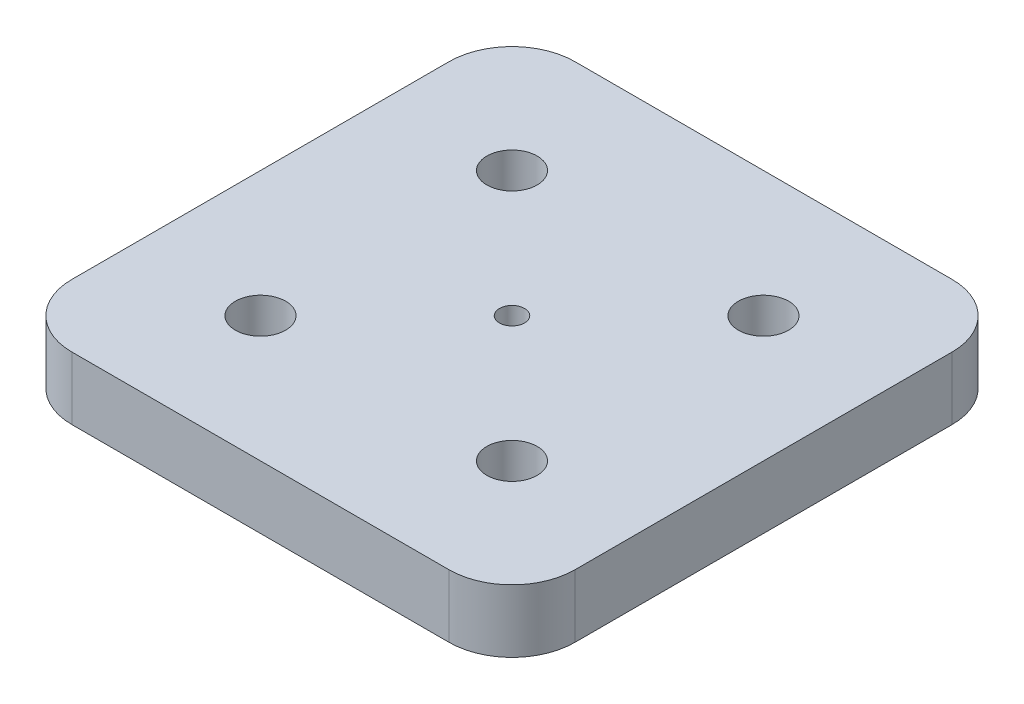
ISO-10303-21;
HEADER;
FILE_DESCRIPTION(('STEP AP214'),'2;1');
FILE_NAME('part.step','',(''),(''),'','','');
FILE_SCHEMA(('AUTOMOTIVE_DESIGN { 1 0 10303 214 1 1 1 1 }'));
ENDSEC;
DATA;
#1=APPLICATION_CONTEXT('core data for automotive mechanical design processes');
#2=APPLICATION_PROTOCOL_DEFINITION('international standard','automotive_design',2000,#1);
#3=PRODUCT_CONTEXT('',#1,'mechanical');
#4=PRODUCT('Part','Part','',(#3));
#5=PRODUCT_RELATED_PRODUCT_CATEGORY('part','',(#4));
#6=PRODUCT_DEFINITION_FORMATION('','',#4);
#7=PRODUCT_DEFINITION_CONTEXT('part definition',#1,'design');
#8=PRODUCT_DEFINITION('design','',#6,#7);
#9=PRODUCT_DEFINITION_SHAPE('','',#8);
#10=(LENGTH_UNIT() NAMED_UNIT(*) SI_UNIT(.MILLI.,.METRE.));
#11=(NAMED_UNIT(*) PLANE_ANGLE_UNIT() SI_UNIT($,.RADIAN.));
#12=(NAMED_UNIT(*) SI_UNIT($,.STERADIAN.) SOLID_ANGLE_UNIT());
#13=UNCERTAINTY_MEASURE_WITH_UNIT(LENGTH_MEASURE(1.E-05),#10,'distance_accuracy_value','');
#14=(GEOMETRIC_REPRESENTATION_CONTEXT(3) GLOBAL_UNCERTAINTY_ASSIGNED_CONTEXT((#13)) GLOBAL_UNIT_ASSIGNED_CONTEXT((#10,
#11,#12)) REPRESENTATION_CONTEXT('',''));
#15=CARTESIAN_POINT('',(0.,0.,0.));
#16=DIRECTION('',(0.,0.,1.));
#17=DIRECTION('',(1.,0.,0.));
#18=AXIS2_PLACEMENT_3D('',#15,#16,#17);
#19=CARTESIAN_POINT('',(0.,5.,0.));
#20=DIRECTION('',(0.,-1.,0.));
#21=DIRECTION('',(0.,0.,-1.));
#22=AXIS2_PLACEMENT_3D('',#19,#20,#21);
#23=PLANE('',#22);
#24=DIRECTION('',(0.,0.,1.));
#25=VECTOR('',#24,1.);
#26=CARTESIAN_POINT('',(0.,5.,0.));
#27=LINE('',#26,#25);
#28=CARTESIAN_POINT('',(0.,5.,-35.));
#29=VERTEX_POINT('',#28);
#30=CARTESIAN_POINT('',(0.,5.,-5.));
#31=VERTEX_POINT('',#30);
#32=EDGE_CURVE('E150',#29,#31,#27,.T.);
#33=ORIENTED_EDGE('',*,*,#32,.T.);
#34=CARTESIAN_POINT('',(5.,5.,-5.));
#35=DIRECTION('',(0.,-1.,0.));
#36=DIRECTION('',(0.,0.,-1.));
#37=AXIS2_PLACEMENT_3D('',#34,#35,#36);
#38=CIRCLE('',#37,5.);
#39=CARTESIAN_POINT('',(5.,5.,0.));
#40=VERTEX_POINT('',#39);
#41=EDGE_CURVE('E174',#31,#40,#38,.F.);
#42=ORIENTED_EDGE('',*,*,#41,.T.);
#43=DIRECTION('',(1.,0.,0.));
#44=VECTOR('',#43,1.);
#45=CARTESIAN_POINT('',(0.,5.,0.));
#46=LINE('',#45,#44);
#47=CARTESIAN_POINT('',(35.,5.,0.));
#48=VERTEX_POINT('',#47);
#49=EDGE_CURVE('E127',#40,#48,#46,.T.);
#50=ORIENTED_EDGE('',*,*,#49,.T.);
#51=CARTESIAN_POINT('',(35.,5.,-5.));
#52=DIRECTION('',(0.,-1.,0.));
#53=DIRECTION('',(0.,0.,-1.));
#54=AXIS2_PLACEMENT_3D('',#51,#52,#53);
#55=CIRCLE('',#54,5.);
#56=CARTESIAN_POINT('',(40.,5.,-5.));
#57=VERTEX_POINT('',#56);
#58=EDGE_CURVE('E171',#48,#57,#55,.F.);
#59=ORIENTED_EDGE('',*,*,#58,.T.);
#60=DIRECTION('',(0.,0.,-1.));
#61=VECTOR('',#60,1.);
#62=CARTESIAN_POINT('',(40.,5.,0.));
#63=LINE('',#62,#61);
#64=CARTESIAN_POINT('',(40.,5.,-35.));
#65=VERTEX_POINT('',#64);
#66=EDGE_CURVE('E186',#57,#65,#63,.T.);
#67=ORIENTED_EDGE('',*,*,#66,.T.);
#68=CARTESIAN_POINT('',(35.,5.,-35.));
#69=DIRECTION('',(0.,-1.,0.));
#70=DIRECTION('',(0.,0.,-1.));
#71=AXIS2_PLACEMENT_3D('',#68,#69,#70);
#72=CIRCLE('',#71,5.);
#73=CARTESIAN_POINT('',(35.,5.,-40.));
#74=VERTEX_POINT('',#73);
#75=EDGE_CURVE('E61',#65,#74,#72,.F.);
#76=ORIENTED_EDGE('',*,*,#75,.T.);
#77=DIRECTION('',(-1.,0.,0.));
#78=VECTOR('',#77,1.);
#79=CARTESIAN_POINT('',(0.,5.,-40.));
#80=LINE('',#79,#78);
#81=CARTESIAN_POINT('',(5.,5.,-40.));
#82=VERTEX_POINT('',#81);
#83=EDGE_CURVE('E152',#74,#82,#80,.T.);
#84=ORIENTED_EDGE('',*,*,#83,.T.);
#85=CARTESIAN_POINT('',(5.,5.,-35.));
#86=DIRECTION('',(0.,-1.,0.));
#87=DIRECTION('',(0.,0.,-1.));
#88=AXIS2_PLACEMENT_3D('',#85,#86,#87);
#89=CIRCLE('',#88,5.);
#90=EDGE_CURVE('E166',#82,#29,#89,.F.);
#91=ORIENTED_EDGE('',*,*,#90,.T.);
#92=EDGE_LOOP('',(#33,#42,#50,#59,#67,#76,#84,#91));
#93=FACE_BOUND('',#92,.T.);
#94=CARTESIAN_POINT('',(10.,5.,-30.));
#95=DIRECTION('',(0.,1.,0.));
#96=DIRECTION('',(0.,0.,1.));
#97=AXIS2_PLACEMENT_3D('',#94,#95,#96);
#98=CIRCLE('',#97,2.);
#99=CARTESIAN_POINT('',(10.,5.,-28.));
#100=VERTEX_POINT('',#99);
#101=EDGE_CURVE('E144',#100,#100,#98,.T.);
#102=ORIENTED_EDGE('',*,*,#101,.F.);
#103=EDGE_LOOP('',(#102));
#104=FACE_BOUND('',#103,.T.);
#105=CARTESIAN_POINT('',(30.,5.,-30.));
#106=DIRECTION('',(0.,1.,0.));
#107=DIRECTION('',(0.,0.,-1.));
#108=AXIS2_PLACEMENT_3D('',#105,#106,#107);
#109=CIRCLE('',#108,2.);
#110=CARTESIAN_POINT('',(30.,5.,-32.));
#111=VERTEX_POINT('',#110);
#112=EDGE_CURVE('E199',#111,#111,#109,.T.);
#113=ORIENTED_EDGE('',*,*,#112,.F.);
#114=EDGE_LOOP('',(#113));
#115=FACE_BOUND('',#114,.T.);
#116=CARTESIAN_POINT('',(30.,5.,-10.));
#117=DIRECTION('',(0.,1.,0.));
#118=DIRECTION('',(0.,0.,1.));
#119=AXIS2_PLACEMENT_3D('',#116,#117,#118);
#120=CIRCLE('',#119,2.);
#121=CARTESIAN_POINT('',(30.,5.,-8.00000000000001));
#122=VERTEX_POINT('',#121);
#123=EDGE_CURVE('E207',#122,#122,#120,.T.);
#124=ORIENTED_EDGE('',*,*,#123,.F.);
#125=EDGE_LOOP('',(#124));
#126=FACE_BOUND('',#125,.T.);
#127=CARTESIAN_POINT('',(10.,5.,-10.));
#128=DIRECTION('',(0.,1.,0.));
#129=DIRECTION('',(0.,0.,-1.));
#130=AXIS2_PLACEMENT_3D('',#127,#128,#129);
#131=CIRCLE('',#130,2.);
#132=CARTESIAN_POINT('',(10.,5.,-12.));
#133=VERTEX_POINT('',#132);
#134=EDGE_CURVE('E215',#133,#133,#131,.T.);
#135=ORIENTED_EDGE('',*,*,#134,.F.);
#136=EDGE_LOOP('',(#135));
#137=FACE_BOUND('',#136,.T.);
#138=CARTESIAN_POINT('',(20.,5.,-20.));
#139=DIRECTION('',(0.,1.,0.));
#140=DIRECTION('',(0.,0.,1.));
#141=AXIS2_PLACEMENT_3D('',#138,#139,#140);
#142=CIRCLE('',#141,1.);
#143=CARTESIAN_POINT('',(20.,5.,-19.));
#144=VERTEX_POINT('',#143);
#145=EDGE_CURVE('E223',#144,#144,#142,.T.);
#146=ORIENTED_EDGE('',*,*,#145,.F.);
#147=EDGE_LOOP('',(#146));
#148=FACE_BOUND('',#147,.T.);
#149=ADVANCED_FACE('F39',(#93,#104,#115,#126,#137,#148),#23,.F.);
#150=CARTESIAN_POINT('',(0.,0.,0.));
#151=DIRECTION('',(0.,-1.,0.));
#152=DIRECTION('',(0.,0.,-1.));
#153=AXIS2_PLACEMENT_3D('',#150,#151,#152);
#154=PLANE('',#153);
#155=CARTESIAN_POINT('',(10.,0.,-10.));
#156=DIRECTION('',(0.,1.,0.));
#157=DIRECTION('',(0.,0.,-1.));
#158=AXIS2_PLACEMENT_3D('',#155,#156,#157);
#159=CIRCLE('',#158,2.);
#160=CARTESIAN_POINT('',(10.,0.,-12.));
#161=VERTEX_POINT('',#160);
#162=EDGE_CURVE('E219',#161,#161,#159,.T.);
#163=ORIENTED_EDGE('',*,*,#162,.T.);
#164=EDGE_LOOP('',(#163));
#165=FACE_BOUND('',#164,.T.);
#166=CARTESIAN_POINT('',(30.,0.,-30.));
#167=DIRECTION('',(0.,1.,0.));
#168=DIRECTION('',(0.,0.,-1.));
#169=AXIS2_PLACEMENT_3D('',#166,#167,#168);
#170=CIRCLE('',#169,2.);
#171=CARTESIAN_POINT('',(30.,0.,-32.));
#172=VERTEX_POINT('',#171);
#173=EDGE_CURVE('E203',#172,#172,#170,.T.);
#174=ORIENTED_EDGE('',*,*,#173,.T.);
#175=EDGE_LOOP('',(#174));
#176=FACE_BOUND('',#175,.T.);
#177=DIRECTION('',(1.,0.,0.));
#178=VECTOR('',#177,1.);
#179=CARTESIAN_POINT('',(0.,0.,0.));
#180=LINE('',#179,#178);
#181=CARTESIAN_POINT('',(5.,0.,0.));
#182=VERTEX_POINT('',#181);
#183=CARTESIAN_POINT('',(35.,0.,0.));
#184=VERTEX_POINT('',#183);
#185=EDGE_CURVE('E124',#182,#184,#180,.T.);
#186=ORIENTED_EDGE('',*,*,#185,.F.);
#187=CARTESIAN_POINT('',(5.,0.,-5.));
#188=DIRECTION('',(0.,-1.,0.));
#189=DIRECTION('',(0.,0.,-1.));
#190=AXIS2_PLACEMENT_3D('',#187,#188,#189);
#191=CIRCLE('',#190,5.);
#192=CARTESIAN_POINT('',(0.,0.,-5.));
#193=VERTEX_POINT('',#192);
#194=EDGE_CURVE('E106',#182,#193,#191,.T.);
#195=ORIENTED_EDGE('',*,*,#194,.T.);
#196=DIRECTION('',(0.,0.,1.));
#197=VECTOR('',#196,1.);
#198=CARTESIAN_POINT('',(0.,0.,0.));
#199=LINE('',#198,#197);
#200=CARTESIAN_POINT('',(0.,0.,-35.));
#201=VERTEX_POINT('',#200);
#202=EDGE_CURVE('E137',#201,#193,#199,.T.);
#203=ORIENTED_EDGE('',*,*,#202,.F.);
#204=CARTESIAN_POINT('',(5.,0.,-35.));
#205=DIRECTION('',(0.,-1.,0.));
#206=DIRECTION('',(0.,0.,-1.));
#207=AXIS2_PLACEMENT_3D('',#204,#205,#206);
#208=CIRCLE('',#207,5.);
#209=CARTESIAN_POINT('',(5.,0.,-40.));
#210=VERTEX_POINT('',#209);
#211=EDGE_CURVE('E129',#201,#210,#208,.T.);
#212=ORIENTED_EDGE('',*,*,#211,.T.);
#213=DIRECTION('',(-1.,0.,0.));
#214=VECTOR('',#213,1.);
#215=CARTESIAN_POINT('',(0.,0.,-40.));
#216=LINE('',#215,#214);
#217=CARTESIAN_POINT('',(35.,0.,-40.));
#218=VERTEX_POINT('',#217);
#219=EDGE_CURVE('E142',#218,#210,#216,.T.);
#220=ORIENTED_EDGE('',*,*,#219,.F.);
#221=CARTESIAN_POINT('',(35.,0.,-35.));
#222=DIRECTION('',(0.,-1.,0.));
#223=DIRECTION('',(0.,0.,-1.));
#224=AXIS2_PLACEMENT_3D('',#221,#222,#223);
#225=CIRCLE('',#224,5.);
#226=CARTESIAN_POINT('',(40.,0.,-35.));
#227=VERTEX_POINT('',#226);
#228=EDGE_CURVE('E156',#218,#227,#225,.T.);
#229=ORIENTED_EDGE('',*,*,#228,.T.);
#230=DIRECTION('',(0.,0.,-1.));
#231=VECTOR('',#230,1.);
#232=CARTESIAN_POINT('',(40.,0.,0.));
#233=LINE('',#232,#231);
#234=CARTESIAN_POINT('',(40.,0.,-5.));
#235=VERTEX_POINT('',#234);
#236=EDGE_CURVE('E136',#235,#227,#233,.T.);
#237=ORIENTED_EDGE('',*,*,#236,.F.);
#238=CARTESIAN_POINT('',(35.,0.,-5.));
#239=DIRECTION('',(0.,-1.,0.));
#240=DIRECTION('',(0.,0.,-1.));
#241=AXIS2_PLACEMENT_3D('',#238,#239,#240);
#242=CIRCLE('',#241,5.);
#243=EDGE_CURVE('E118',#235,#184,#242,.T.);
#244=ORIENTED_EDGE('',*,*,#243,.T.);
#245=EDGE_LOOP('',(#186,#195,#203,#212,#220,#229,#237,#244));
#246=FACE_BOUND('',#245,.T.);
#247=CARTESIAN_POINT('',(10.,0.,-30.));
#248=DIRECTION('',(0.,1.,0.));
#249=DIRECTION('',(0.,0.,1.));
#250=AXIS2_PLACEMENT_3D('',#247,#248,#249);
#251=CIRCLE('',#250,2.);
#252=CARTESIAN_POINT('',(10.,0.,-28.));
#253=VERTEX_POINT('',#252);
#254=EDGE_CURVE('E195',#253,#253,#251,.T.);
#255=ORIENTED_EDGE('',*,*,#254,.T.);
#256=EDGE_LOOP('',(#255));
#257=FACE_BOUND('',#256,.T.);
#258=CARTESIAN_POINT('',(30.,0.,-10.));
#259=DIRECTION('',(0.,1.,0.));
#260=DIRECTION('',(0.,0.,1.));
#261=AXIS2_PLACEMENT_3D('',#258,#259,#260);
#262=CIRCLE('',#261,2.);
#263=CARTESIAN_POINT('',(30.,0.,-8.00000000000001));
#264=VERTEX_POINT('',#263);
#265=EDGE_CURVE('E211',#264,#264,#262,.T.);
#266=ORIENTED_EDGE('',*,*,#265,.T.);
#267=EDGE_LOOP('',(#266));
#268=FACE_BOUND('',#267,.T.);
#269=CARTESIAN_POINT('',(20.,0.,-20.));
#270=DIRECTION('',(0.,1.,0.));
#271=DIRECTION('',(0.,0.,1.));
#272=AXIS2_PLACEMENT_3D('',#269,#270,#271);
#273=CIRCLE('',#272,1.);
#274=CARTESIAN_POINT('',(20.,0.,-19.));
#275=VERTEX_POINT('',#274);
#276=EDGE_CURVE('E227',#275,#275,#273,.T.);
#277=ORIENTED_EDGE('',*,*,#276,.T.);
#278=EDGE_LOOP('',(#277));
#279=FACE_BOUND('',#278,.T.);
#280=ADVANCED_FACE('F132',(#165,#176,#246,#257,#268,#279),#154,.T.);
#281=CARTESIAN_POINT('',(0.,5.,0.));
#282=DIRECTION('',(1.,0.,0.));
#283=DIRECTION('',(0.,0.,-1.));
#284=AXIS2_PLACEMENT_3D('',#281,#282,#283);
#285=PLANE('',#284);
#286=ORIENTED_EDGE('',*,*,#202,.T.);
#287=DIRECTION('',(0.,-1.,0.));
#288=VECTOR('',#287,1.);
#289=CARTESIAN_POINT('',(0.,5.,-5.));
#290=LINE('',#289,#288);
#291=EDGE_CURVE('E111',#193,#31,#290,.F.);
#292=ORIENTED_EDGE('',*,*,#291,.T.);
#293=ORIENTED_EDGE('',*,*,#32,.F.);
#294=DIRECTION('',(0.,-1.,0.));
#295=VECTOR('',#294,1.);
#296=CARTESIAN_POINT('',(0.,5.,-35.));
#297=LINE('',#296,#295);
#298=EDGE_CURVE('E117',#29,#201,#297,.T.);
#299=ORIENTED_EDGE('',*,*,#298,.T.);
#300=EDGE_LOOP('',(#286,#292,#293,#299));
#301=FACE_BOUND('',#300,.T.);
#302=ADVANCED_FACE('F243',(#301),#285,.F.);
#303=CARTESIAN_POINT('',(0.,5.,0.));
#304=DIRECTION('',(0.,0.,-1.));
#305=DIRECTION('',(-1.,0.,0.));
#306=AXIS2_PLACEMENT_3D('',#303,#304,#305);
#307=PLANE('',#306);
#308=ORIENTED_EDGE('',*,*,#49,.F.);
#309=DIRECTION('',(0.,-1.,0.));
#310=VECTOR('',#309,1.);
#311=CARTESIAN_POINT('',(5.,5.,0.));
#312=LINE('',#311,#310);
#313=EDGE_CURVE('E110',#40,#182,#312,.T.);
#314=ORIENTED_EDGE('',*,*,#313,.T.);
#315=ORIENTED_EDGE('',*,*,#185,.T.);
#316=DIRECTION('',(0.,-1.,0.));
#317=VECTOR('',#316,1.);
#318=CARTESIAN_POINT('',(35.,5.,0.));
#319=LINE('',#318,#317);
#320=EDGE_CURVE('E130',#184,#48,#319,.F.);
#321=ORIENTED_EDGE('',*,*,#320,.T.);
#322=EDGE_LOOP('',(#308,#314,#315,#321));
#323=FACE_BOUND('',#322,.T.);
#324=ADVANCED_FACE('F123',(#323),#307,.F.);
#325=CARTESIAN_POINT('',(40.,5.,0.));
#326=DIRECTION('',(-1.,0.,0.));
#327=DIRECTION('',(0.,0.,1.));
#328=AXIS2_PLACEMENT_3D('',#325,#326,#327);
#329=PLANE('',#328);
#330=ORIENTED_EDGE('',*,*,#66,.F.);
#331=DIRECTION('',(0.,-1.,0.));
#332=VECTOR('',#331,1.);
#333=CARTESIAN_POINT('',(40.,5.,-5.));
#334=LINE('',#333,#332);
#335=EDGE_CURVE('E180',#57,#235,#334,.T.);
#336=ORIENTED_EDGE('',*,*,#335,.T.);
#337=ORIENTED_EDGE('',*,*,#236,.T.);
#338=DIRECTION('',(0.,-1.,0.));
#339=VECTOR('',#338,1.);
#340=CARTESIAN_POINT('',(40.,5.,-35.));
#341=LINE('',#340,#339);
#342=EDGE_CURVE('E177',#227,#65,#341,.F.);
#343=ORIENTED_EDGE('',*,*,#342,.T.);
#344=EDGE_LOOP('',(#330,#336,#337,#343));
#345=FACE_BOUND('',#344,.T.);
#346=ADVANCED_FACE('F254',(#345),#329,.F.);
#347=CARTESIAN_POINT('',(0.,5.,-40.));
#348=DIRECTION('',(0.,0.,1.));
#349=DIRECTION('',(1.,0.,0.));
#350=AXIS2_PLACEMENT_3D('',#347,#348,#349);
#351=PLANE('',#350);
#352=ORIENTED_EDGE('',*,*,#83,.F.);
#353=DIRECTION('',(0.,-1.,0.));
#354=VECTOR('',#353,1.);
#355=CARTESIAN_POINT('',(35.,5.,-40.));
#356=LINE('',#355,#354);
#357=EDGE_CURVE('E11',#74,#218,#356,.T.);
#358=ORIENTED_EDGE('',*,*,#357,.T.);
#359=ORIENTED_EDGE('',*,*,#219,.T.);
#360=DIRECTION('',(0.,-1.,0.));
#361=VECTOR('',#360,1.);
#362=CARTESIAN_POINT('',(5.,5.,-40.));
#363=LINE('',#362,#361);
#364=EDGE_CURVE('E48',#210,#82,#363,.F.);
#365=ORIENTED_EDGE('',*,*,#364,.T.);
#366=EDGE_LOOP('',(#352,#358,#359,#365));
#367=FACE_BOUND('',#366,.T.);
#368=ADVANCED_FACE('F251',(#367),#351,.F.);
#369=CARTESIAN_POINT('',(10.,5.,-30.));
#370=DIRECTION('',(0.,-1.,0.));
#371=DIRECTION('',(0.,0.,-1.));
#372=AXIS2_PLACEMENT_3D('',#369,#370,#371);
#373=CYLINDRICAL_SURFACE('',#372,2.);
#374=ORIENTED_EDGE('',*,*,#101,.T.);
#375=EDGE_LOOP('',(#374));
#376=FACE_BOUND('',#375,.T.);
#377=ORIENTED_EDGE('',*,*,#254,.F.);
#378=EDGE_LOOP('',(#377));
#379=FACE_BOUND('',#378,.T.);
#380=ADVANCED_FACE('F248',(#376,#379),#373,.F.);
#381=CARTESIAN_POINT('',(30.,5.,-30.));
#382=DIRECTION('',(0.,-1.,0.));
#383=DIRECTION('',(0.,0.,-1.));
#384=AXIS2_PLACEMENT_3D('',#381,#382,#383);
#385=CYLINDRICAL_SURFACE('',#384,2.);
#386=ORIENTED_EDGE('',*,*,#112,.T.);
#387=EDGE_LOOP('',(#386));
#388=FACE_BOUND('',#387,.T.);
#389=ORIENTED_EDGE('',*,*,#173,.F.);
#390=EDGE_LOOP('',(#389));
#391=FACE_BOUND('',#390,.T.);
#392=ADVANCED_FACE('F365',(#388,#391),#385,.F.);
#393=CARTESIAN_POINT('',(30.,5.,-10.));
#394=DIRECTION('',(0.,-1.,0.));
#395=DIRECTION('',(0.,0.,-1.));
#396=AXIS2_PLACEMENT_3D('',#393,#394,#395);
#397=CYLINDRICAL_SURFACE('',#396,2.);
#398=ORIENTED_EDGE('',*,*,#123,.T.);
#399=EDGE_LOOP('',(#398));
#400=FACE_BOUND('',#399,.T.);
#401=ORIENTED_EDGE('',*,*,#265,.F.);
#402=EDGE_LOOP('',(#401));
#403=FACE_BOUND('',#402,.T.);
#404=ADVANCED_FACE('F355',(#400,#403),#397,.F.);
#405=CARTESIAN_POINT('',(10.,5.,-10.));
#406=DIRECTION('',(0.,-1.,0.));
#407=DIRECTION('',(0.,0.,-1.));
#408=AXIS2_PLACEMENT_3D('',#405,#406,#407);
#409=CYLINDRICAL_SURFACE('',#408,2.);
#410=ORIENTED_EDGE('',*,*,#134,.T.);
#411=EDGE_LOOP('',(#410));
#412=FACE_BOUND('',#411,.T.);
#413=ORIENTED_EDGE('',*,*,#162,.F.);
#414=EDGE_LOOP('',(#413));
#415=FACE_BOUND('',#414,.T.);
#416=ADVANCED_FACE('F346',(#412,#415),#409,.F.);
#417=CARTESIAN_POINT('',(20.,5.,-20.));
#418=DIRECTION('',(0.,-1.,0.));
#419=DIRECTION('',(0.,0.,-1.));
#420=AXIS2_PLACEMENT_3D('',#417,#418,#419);
#421=CYLINDRICAL_SURFACE('',#420,1.);
#422=ORIENTED_EDGE('',*,*,#145,.T.);
#423=EDGE_LOOP('',(#422));
#424=FACE_BOUND('',#423,.T.);
#425=ORIENTED_EDGE('',*,*,#276,.F.);
#426=EDGE_LOOP('',(#425));
#427=FACE_BOUND('',#426,.T.);
#428=ADVANCED_FACE('F235',(#424,#427),#421,.F.);
#429=CARTESIAN_POINT('',(5.,5.,-5.));
#430=DIRECTION('',(0.,-1.,0.));
#431=DIRECTION('',(0.,0.,-1.));
#432=AXIS2_PLACEMENT_3D('',#429,#430,#431);
#433=CYLINDRICAL_SURFACE('',#432,5.);
#434=ORIENTED_EDGE('',*,*,#41,.F.);
#435=ORIENTED_EDGE('',*,*,#291,.F.);
#436=ORIENTED_EDGE('',*,*,#194,.F.);
#437=ORIENTED_EDGE('',*,*,#313,.F.);
#438=EDGE_LOOP('',(#434,#435,#436,#437));
#439=FACE_BOUND('',#438,.T.);
#440=ADVANCED_FACE('F109',(#439),#433,.T.);
#441=CARTESIAN_POINT('',(35.,5.,-5.));
#442=DIRECTION('',(0.,-1.,0.));
#443=DIRECTION('',(0.,0.,-1.));
#444=AXIS2_PLACEMENT_3D('',#441,#442,#443);
#445=CYLINDRICAL_SURFACE('',#444,5.);
#446=ORIENTED_EDGE('',*,*,#58,.F.);
#447=ORIENTED_EDGE('',*,*,#320,.F.);
#448=ORIENTED_EDGE('',*,*,#243,.F.);
#449=ORIENTED_EDGE('',*,*,#335,.F.);
#450=EDGE_LOOP('',(#446,#447,#448,#449));
#451=FACE_BOUND('',#450,.T.);
#452=ADVANCED_FACE('F265',(#451),#445,.T.);
#453=CARTESIAN_POINT('',(35.,5.,-35.));
#454=DIRECTION('',(0.,-1.,0.));
#455=DIRECTION('',(0.,0.,-1.));
#456=AXIS2_PLACEMENT_3D('',#453,#454,#455);
#457=CYLINDRICAL_SURFACE('',#456,5.);
#458=ORIENTED_EDGE('',*,*,#75,.F.);
#459=ORIENTED_EDGE('',*,*,#342,.F.);
#460=ORIENTED_EDGE('',*,*,#228,.F.);
#461=ORIENTED_EDGE('',*,*,#357,.F.);
#462=EDGE_LOOP('',(#458,#459,#460,#461));
#463=FACE_BOUND('',#462,.T.);
#464=ADVANCED_FACE('F267',(#463),#457,.T.);
#465=CARTESIAN_POINT('',(5.,5.,-35.));
#466=DIRECTION('',(0.,-1.,0.));
#467=DIRECTION('',(0.,0.,-1.));
#468=AXIS2_PLACEMENT_3D('',#465,#466,#467);
#469=CYLINDRICAL_SURFACE('',#468,5.);
#470=ORIENTED_EDGE('',*,*,#90,.F.);
#471=ORIENTED_EDGE('',*,*,#364,.F.);
#472=ORIENTED_EDGE('',*,*,#211,.F.);
#473=ORIENTED_EDGE('',*,*,#298,.F.);
#474=EDGE_LOOP('',(#470,#471,#472,#473));
#475=FACE_BOUND('',#474,.T.);
#476=ADVANCED_FACE('F41',(#475),#469,.T.);
#477=CLOSED_SHELL('',(#149,#280,#302,#324,#346,#368,#380,#392,#404,#416,#428,#440,#452,#464,#476));
#478=MANIFOLD_SOLID_BREP('B2',#477);
#479=ADVANCED_BREP_SHAPE_REPRESENTATION('',(#18,#478),#14);
#480=SHAPE_DEFINITION_REPRESENTATION(#9,#479);
ENDSEC;
END-ISO-10303-21;
